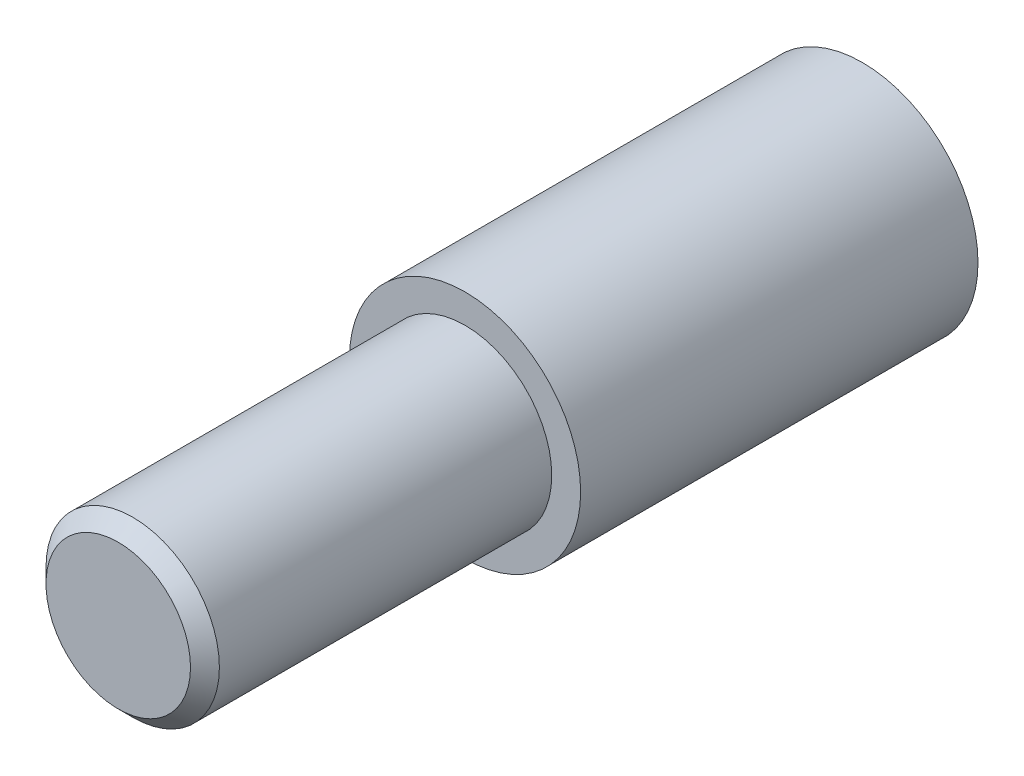
ISO-10303-21;
HEADER;
FILE_DESCRIPTION(('STEP AP214'),'2;1');
FILE_NAME('part.step','',(''),(''),'','','');
FILE_SCHEMA(('AUTOMOTIVE_DESIGN { 1 0 10303 214 1 1 1 1 }'));
ENDSEC;
DATA;
#1=APPLICATION_CONTEXT('core data for automotive mechanical design processes');
#2=APPLICATION_PROTOCOL_DEFINITION('international standard','automotive_design',2000,#1);
#3=PRODUCT_CONTEXT('',#1,'mechanical');
#4=PRODUCT('Part','Part','',(#3));
#5=PRODUCT_RELATED_PRODUCT_CATEGORY('part','',(#4));
#6=PRODUCT_DEFINITION_FORMATION('','',#4);
#7=PRODUCT_DEFINITION_CONTEXT('part definition',#1,'design');
#8=PRODUCT_DEFINITION('design','',#6,#7);
#9=PRODUCT_DEFINITION_SHAPE('','',#8);
#10=(LENGTH_UNIT() NAMED_UNIT(*) SI_UNIT(.MILLI.,.METRE.));
#11=(NAMED_UNIT(*) PLANE_ANGLE_UNIT() SI_UNIT($,.RADIAN.));
#12=(NAMED_UNIT(*) SI_UNIT($,.STERADIAN.) SOLID_ANGLE_UNIT());
#13=UNCERTAINTY_MEASURE_WITH_UNIT(LENGTH_MEASURE(1.E-05),#10,'distance_accuracy_value','');
#14=(GEOMETRIC_REPRESENTATION_CONTEXT(3) GLOBAL_UNCERTAINTY_ASSIGNED_CONTEXT((#13)) GLOBAL_UNIT_ASSIGNED_CONTEXT((#10,
#11,#12)) REPRESENTATION_CONTEXT('',''));
#15=CARTESIAN_POINT('',(0.,0.,0.));
#16=DIRECTION('',(0.,0.,1.));
#17=DIRECTION('',(1.,0.,0.));
#18=AXIS2_PLACEMENT_3D('',#15,#16,#17);
#19=CARTESIAN_POINT('',(0.,0.,27.5));
#20=DIRECTION('',(0.,0.,1.));
#21=DIRECTION('',(1.,0.,0.));
#22=AXIS2_PLACEMENT_3D('',#19,#20,#21);
#23=PLANE('',#22);
#24=CARTESIAN_POINT('',(0.,0.,27.5));
#25=DIRECTION('',(0.,0.,1.));
#26=DIRECTION('',(1.,0.,0.));
#27=AXIS2_PLACEMENT_3D('',#24,#25,#26);
#28=CIRCLE('',#27,8.);
#29=CARTESIAN_POINT('',(8.,0.,27.5));
#30=VERTEX_POINT('',#29);
#31=EDGE_CURVE('E42',#30,#30,#28,.T.);
#32=ORIENTED_EDGE('',*,*,#31,.T.);
#33=EDGE_LOOP('',(#32));
#34=FACE_BOUND('',#33,.T.);
#35=CARTESIAN_POINT('',(0.,0.,27.5));
#36=DIRECTION('',(0.,0.,1.));
#37=DIRECTION('',(1.,0.,0.));
#38=AXIS2_PLACEMENT_3D('',#35,#36,#37);
#39=CIRCLE('',#38,6.);
#40=CARTESIAN_POINT('',(6.,0.,27.5));
#41=VERTEX_POINT('',#40);
#42=EDGE_CURVE('E50',#41,#41,#39,.T.);
#43=ORIENTED_EDGE('',*,*,#42,.F.);
#44=EDGE_LOOP('',(#43));
#45=FACE_BOUND('',#44,.T.);
#46=ADVANCED_FACE('F31',(#34,#45),#23,.T.);
#47=CARTESIAN_POINT('',(0.,0.,27.5));
#48=DIRECTION('',(0.,0.,-1.));
#49=DIRECTION('',(-1.,0.,0.));
#50=AXIS2_PLACEMENT_3D('',#47,#48,#49);
#51=CYLINDRICAL_SURFACE('',#50,8.);
#52=ORIENTED_EDGE('',*,*,#31,.F.);
#53=EDGE_LOOP('',(#52));
#54=FACE_BOUND('',#53,.T.);
#55=CARTESIAN_POINT('',(0.,0.,0.));
#56=DIRECTION('',(0.,0.,1.));
#57=DIRECTION('',(1.,0.,0.));
#58=AXIS2_PLACEMENT_3D('',#55,#56,#57);
#59=CIRCLE('',#58,8.);
#60=CARTESIAN_POINT('',(8.,0.,0.));
#61=VERTEX_POINT('',#60);
#62=EDGE_CURVE('E46',#61,#61,#59,.T.);
#63=ORIENTED_EDGE('',*,*,#62,.T.);
#64=EDGE_LOOP('',(#63));
#65=FACE_BOUND('',#64,.T.);
#66=ADVANCED_FACE('F58',(#54,#65),#51,.T.);
#67=CARTESIAN_POINT('',(0.,0.,0.));
#68=DIRECTION('',(0.,0.,1.));
#69=DIRECTION('',(1.,0.,0.));
#70=AXIS2_PLACEMENT_3D('',#67,#68,#69);
#71=PLANE('',#70);
#72=ORIENTED_EDGE('',*,*,#62,.F.);
#73=EDGE_LOOP('',(#72));
#74=FACE_BOUND('',#73,.T.);
#75=ADVANCED_FACE('F64',(#74),#71,.F.);
#76=CARTESIAN_POINT('',(0.,0.,51.5));
#77=DIRECTION('',(0.,0.,-1.));
#78=DIRECTION('',(-1.,0.,0.));
#79=AXIS2_PLACEMENT_3D('',#76,#77,#78);
#80=CYLINDRICAL_SURFACE('',#79,6.);
#81=CARTESIAN_POINT('',(0.,0.,50.5));
#82=DIRECTION('',(0.,0.,1.));
#83=DIRECTION('',(1.,0.,0.));
#84=AXIS2_PLACEMENT_3D('',#81,#82,#83);
#85=CIRCLE('',#84,6.);
#86=CARTESIAN_POINT('',(6.,0.,50.5));
#87=VERTEX_POINT('',#86);
#88=EDGE_CURVE('E10',#87,#87,#85,.F.);
#89=ORIENTED_EDGE('',*,*,#88,.T.);
#90=EDGE_LOOP('',(#89));
#91=FACE_BOUND('',#90,.T.);
#92=ORIENTED_EDGE('',*,*,#42,.T.);
#93=EDGE_LOOP('',(#92));
#94=FACE_BOUND('',#93,.T.);
#95=ADVANCED_FACE('F55',(#91,#94),#80,.T.);
#96=CARTESIAN_POINT('',(0.,0.,51.5));
#97=DIRECTION('',(0.,0.,1.));
#98=DIRECTION('',(1.,0.,0.));
#99=AXIS2_PLACEMENT_3D('',#96,#97,#98);
#100=PLANE('',#99);
#101=CARTESIAN_POINT('',(0.,0.,51.5));
#102=DIRECTION('',(0.,0.,1.));
#103=DIRECTION('',(1.,0.,0.));
#104=AXIS2_PLACEMENT_3D('',#101,#102,#103);
#105=CIRCLE('',#104,5.);
#106=CARTESIAN_POINT('',(5.,0.,51.5));
#107=VERTEX_POINT('',#106);
#108=EDGE_CURVE('E38',#107,#107,#105,.T.);
#109=ORIENTED_EDGE('',*,*,#108,.T.);
#110=EDGE_LOOP('',(#109));
#111=FACE_BOUND('',#110,.T.);
#112=ADVANCED_FACE('F74',(#111),#100,.T.);
#113=CARTESIAN_POINT('',(0.,0.,51.5));
#114=DIRECTION('',(0.,0.,-1.));
#115=DIRECTION('',(-1.,0.,0.));
#116=AXIS2_PLACEMENT_3D('',#113,#114,#115);
#117=CONICAL_SURFACE('',#116,5.,0.785398163397446);
#118=ORIENTED_EDGE('',*,*,#88,.F.);
#119=EDGE_LOOP('',(#118));
#120=FACE_BOUND('',#119,.T.);
#121=ORIENTED_EDGE('',*,*,#108,.F.);
#122=EDGE_LOOP('',(#121));
#123=FACE_BOUND('',#122,.T.);
#124=ADVANCED_FACE('F33',(#120,#123),#117,.T.);
#125=CLOSED_SHELL('',(#46,#66,#75,#95,#112,#124));
#126=MANIFOLD_SOLID_BREP('B2',#125);
#127=ADVANCED_BREP_SHAPE_REPRESENTATION('',(#18,#126),#14);
#128=SHAPE_DEFINITION_REPRESENTATION(#9,#127);
ENDSEC;
END-ISO-10303-21;
